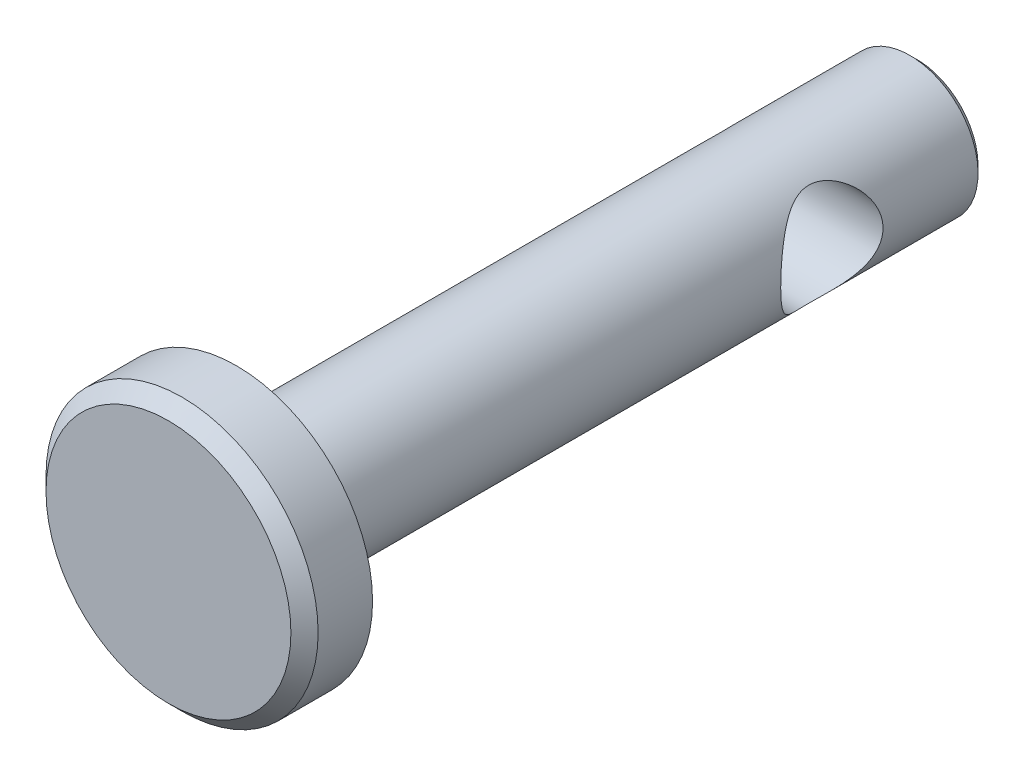
ISO-10303-21;
HEADER;
FILE_DESCRIPTION(('STEP AP214'),'2;1');
FILE_NAME('part.step','',(''),(''),'','','');
FILE_SCHEMA(('AUTOMOTIVE_DESIGN { 1 0 10303 214 1 1 1 1 }'));
ENDSEC;
DATA;
#1=APPLICATION_CONTEXT('core data for automotive mechanical design processes');
#2=APPLICATION_PROTOCOL_DEFINITION('international standard','automotive_design',2000,#1);
#3=PRODUCT_CONTEXT('',#1,'mechanical');
#4=PRODUCT('Part','Part','',(#3));
#5=PRODUCT_RELATED_PRODUCT_CATEGORY('part','',(#4));
#6=PRODUCT_DEFINITION_FORMATION('','',#4);
#7=PRODUCT_DEFINITION_CONTEXT('part definition',#1,'design');
#8=PRODUCT_DEFINITION('design','',#6,#7);
#9=PRODUCT_DEFINITION_SHAPE('','',#8);
#10=(LENGTH_UNIT() NAMED_UNIT(*) SI_UNIT(.MILLI.,.METRE.));
#11=(NAMED_UNIT(*) PLANE_ANGLE_UNIT() SI_UNIT($,.RADIAN.));
#12=(NAMED_UNIT(*) SI_UNIT($,.STERADIAN.) SOLID_ANGLE_UNIT());
#13=UNCERTAINTY_MEASURE_WITH_UNIT(LENGTH_MEASURE(1.E-05),#10,'distance_accuracy_value','');
#14=(GEOMETRIC_REPRESENTATION_CONTEXT(3) GLOBAL_UNCERTAINTY_ASSIGNED_CONTEXT((#13)) GLOBAL_UNIT_ASSIGNED_CONTEXT((#10,
#11,#12)) REPRESENTATION_CONTEXT('',''));
#15=CARTESIAN_POINT('',(0.,0.,0.));
#16=DIRECTION('',(0.,0.,1.));
#17=DIRECTION('',(1.,0.,0.));
#18=AXIS2_PLACEMENT_3D('',#15,#16,#17);
#19=CARTESIAN_POINT('',(0.,3.175,1.5875));
#20=DIRECTION('',(0.,0.,-1.));
#21=DIRECTION('',(0.,1.,0.));
#22=AXIS2_PLACEMENT_3D('',#19,#20,#21);
#23=PLANE('',#22);
#24=CARTESIAN_POINT('',(0.,0.,1.5875));
#25=DIRECTION('',(0.,0.,-1.));
#26=DIRECTION('',(0.,1.,0.));
#27=AXIS2_PLACEMENT_3D('',#24,#25,#26);
#28=CIRCLE('',#27,2.85749999999999);
#29=CARTESIAN_POINT('',(0.,2.85749999999999,1.5875));
#30=VERTEX_POINT('',#29);
#31=EDGE_CURVE('E59',#30,#30,#28,.F.);
#32=ORIENTED_EDGE('',*,*,#31,.T.);
#33=EDGE_LOOP('',(#32));
#34=FACE_BOUND('',#33,.T.);
#35=ADVANCED_FACE('F41',(#34),#23,.F.);
#36=CARTESIAN_POINT('',(0.,0.,-15.875));
#37=DIRECTION('',(0.,0.,1.));
#38=DIRECTION('',(0.,-1.,0.));
#39=AXIS2_PLACEMENT_3D('',#36,#37,#38);
#40=PLANE('',#39);
#41=CARTESIAN_POINT('',(0.,0.,-15.875));
#42=DIRECTION('',(0.,0.,1.));
#43=DIRECTION('',(0.,-1.,0.));
#44=AXIS2_PLACEMENT_3D('',#41,#42,#43);
#45=CIRCLE('',#44,1.42874999999996);
#46=CARTESIAN_POINT('',(0.,-1.42874999999996,-15.875));
#47=VERTEX_POINT('',#46);
#48=EDGE_CURVE('E10',#47,#47,#45,.F.);
#49=ORIENTED_EDGE('',*,*,#48,.T.);
#50=EDGE_LOOP('',(#49));
#51=FACE_BOUND('',#50,.T.);
#52=ADVANCED_FACE('F101',(#51),#40,.F.);
#53=CARTESIAN_POINT('',(0.,0.,1.5875));
#54=DIRECTION('',(0.,0.,1.));
#55=DIRECTION('',(0.,-1.,0.));
#56=AXIS2_PLACEMENT_3D('',#53,#54,#55);
#57=CYLINDRICAL_SURFACE('',#56,1.58749999999996);
#58=CARTESIAN_POINT('',(0.,0.,-15.71625));
#59=DIRECTION('',(0.,0.,1.));
#60=DIRECTION('',(0.,-1.,0.));
#61=AXIS2_PLACEMENT_3D('',#58,#59,#60);
#62=CIRCLE('',#61,1.58749999999996);
#63=CARTESIAN_POINT('',(0.,-1.58749999999996,-15.71625));
#64=VERTEX_POINT('',#63);
#65=EDGE_CURVE('E49',#64,#64,#62,.T.);
#66=ORIENTED_EDGE('',*,*,#65,.T.);
#67=EDGE_LOOP('',(#66));
#68=FACE_BOUND('',#67,.T.);
#69=CARTESIAN_POINT('',(1.58749999999996,0.,-11.1125));
#70=CARTESIAN_POINT('',(1.58749611202192,0.0582400089712494,-11.112504048731));
#71=CARTESIAN_POINT('',(1.58426132337945,0.116571092588428,-11.1167964551169));
#72=CARTESIAN_POINT('',(1.57161329724709,0.231395079350687,-11.1336957204802));
#73=CARTESIAN_POINT('',(1.56218511689408,0.28788318906127,-11.1463226887003));
#74=CARTESIAN_POINT('',(1.53805521874961,0.397051087064882,-11.1790302967116));
#75=CARTESIAN_POINT('',(1.52338545829249,0.449751678169732,-11.1990657928055));
#76=CARTESIAN_POINT('',(1.48987548341851,0.550689971898316,-11.2456434667305));
#77=CARTESIAN_POINT('',(1.47103637617336,0.598928854517479,-11.2721839173689));
#78=CARTESIAN_POINT('',(1.42848471386693,0.694680005115794,-11.3336187262041));
#79=CARTESIAN_POINT('',(1.40448224261945,0.74171012253274,-11.3690595150722));
#80=CARTESIAN_POINT('',(1.35445854154786,0.829553943149386,-11.4458299935339));
#81=CARTESIAN_POINT('',(1.32843424535865,0.870357914423504,-11.4871687107833));
#82=CARTESIAN_POINT('',(1.27068479737996,0.9531799323061,-11.584169997728));
#83=CARTESIAN_POINT('',(1.23888117921047,0.993742907098825,-11.6410335129717));
#84=CARTESIAN_POINT('',(1.178275635493,1.06489206788819,-11.762163401124));
#85=CARTESIAN_POINT('',(1.14946970080022,1.09549169878323,-11.8264196381265));
#86=CARTESIAN_POINT('',(1.10835974170717,1.13676501194142,-11.9386602569936));
#87=CARTESIAN_POINT('',(1.09379064722662,1.15067121407519,-11.9846148046341));
#88=CARTESIAN_POINT('',(1.06983233223599,1.17298121093542,-12.0791015965493));
#89=CARTESIAN_POINT('',(1.06043121477492,1.18139765178729,-12.1276276361145));
#90=CARTESIAN_POINT('',(1.0482907574516,1.19218967004258,-12.2266758845225));
#91=CARTESIAN_POINT('',(1.04561306901394,1.19450935132434,-12.2772122808398));
#92=CARTESIAN_POINT('',(1.04766413974648,1.19270985237305,-12.3780284771758));
#93=CARTESIAN_POINT('',(1.05239537560604,1.18858851900885,-12.4283081857502));
#94=CARTESIAN_POINT('',(1.06743533103026,1.17508360539052,-12.5215085968116));
#95=CARTESIAN_POINT('',(1.07708192277855,1.16632068351073,-12.564635159479));
#96=CARTESIAN_POINT('',(1.10026903393572,1.14447308122112,-12.648686024988));
#97=CARTESIAN_POINT('',(1.11381333728087,1.13138419928488,-12.6896081416781));
#98=CARTESIAN_POINT('',(1.15290197907022,1.09185551143224,-12.7939435116001));
#99=CARTESIAN_POINT('',(1.1806362202507,1.06219612507049,-12.8553164585136));
#100=CARTESIAN_POINT('',(1.23884845074033,0.993702457646841,-12.9713324826481));
#101=CARTESIAN_POINT('',(1.26933302873669,0.954845761924156,-13.0259586143659));
#102=CARTESIAN_POINT('',(1.3307177095422,0.867340615100063,-13.1294548253315));
#103=CARTESIAN_POINT('',(1.36160815500147,0.818464823163825,-13.1781393999279));
#104=CARTESIAN_POINT('',(1.42018729468893,0.711972733099075,-13.2670529443622));
#105=CARTESIAN_POINT('',(1.44788202748529,0.654373411630266,-13.3072979831154));
#106=CARTESIAN_POINT('',(1.49255937974563,0.543375678884274,-13.3707877427964));
#107=CARTESIAN_POINT('',(1.51057698528293,0.491421390850462,-13.3958217365705));
#108=CARTESIAN_POINT('',(1.54160267629896,0.383120959812429,-13.4384464306424));
#109=CARTESIAN_POINT('',(1.55461387180878,0.326777569607676,-13.4560417525893));
#110=CARTESIAN_POINT('',(1.57456526025459,0.210682235925732,-13.4828795513269));
#111=CARTESIAN_POINT('',(1.58146728549927,0.150911313378138,-13.4920695265348));
#112=CARTESIAN_POINT('',(1.58835864577543,0.0302752509871462,-13.5012457428002));
#113=CARTESIAN_POINT('',(1.5883510332554,-0.030589393802868,-13.5012360479663));
#114=CARTESIAN_POINT('',(1.5817945877245,-0.14501811852837,-13.4925049534587));
#115=CARTESIAN_POINT('',(1.57591384970654,-0.1986929850182,-13.484673329038));
#116=CARTESIAN_POINT('',(1.55908265824004,-0.303723073443494,-13.4620671690358));
#117=CARTESIAN_POINT('',(1.54813114648291,-0.355077808693203,-13.4472911841043));
#118=CARTESIAN_POINT('',(1.52151176197056,-0.456045209324149,-13.4109081835218));
#119=CARTESIAN_POINT('',(1.50569808574503,-0.505541757920168,-13.3890887703169));
#120=CARTESIAN_POINT('',(1.47055050484391,-0.600156812323727,-13.3396549943913));
#121=CARTESIAN_POINT('',(1.45121610643682,-0.645274702724286,-13.3120398188138));
#122=CARTESIAN_POINT('',(1.40668133727196,-0.737877110468318,-13.2467362523664));
#123=CARTESIAN_POINT('',(1.38104027666388,-0.784504868153483,-13.2081362236221));
#124=CARTESIAN_POINT('',(1.32814791913204,-0.871068853718371,-13.1248443846369));
#125=CARTESIAN_POINT('',(1.30089319575508,-0.910990097537625,-13.0801393275185));
#126=CARTESIAN_POINT('',(1.24150416985761,-0.990828264860102,-12.9760177439497));
#127=CARTESIAN_POINT('',(1.20943783950668,-1.02927233640268,-12.915424681195));
#128=CARTESIAN_POINT('',(1.14994929880441,-1.09532583053485,-12.7865405156686));
#129=CARTESIAN_POINT('',(1.12251399992908,-1.12296608908653,-12.7182720487179));
#130=CARTESIAN_POINT('',(1.0867545290757,-1.15736064850763,-12.602560847327));
#131=CARTESIAN_POINT('',(1.07514574754341,-1.16805755109581,-12.5573193816267));
#132=CARTESIAN_POINT('',(1.05740659988987,-1.18414258325223,-12.4649003511348));
#133=CARTESIAN_POINT('',(1.05126379878146,-1.18954276562458,-12.4177274376278));
#134=CARTESIAN_POINT('',(1.04546055627034,-1.19464934449511,-12.3223942180421));
#135=CARTESIAN_POINT('',(1.04583560652371,-1.19432456673063,-12.2742299332483));
#136=CARTESIAN_POINT('',(1.05308483711188,-1.18793443725808,-12.1787586214641));
#137=CARTESIAN_POINT('',(1.05996708886514,-1.18186195618976,-12.131452733496));
#138=CARTESIAN_POINT('',(1.08105685565797,-1.16263091032965,-12.0293913981011));
#139=CARTESIAN_POINT('',(1.09648769678375,-1.14826379093169,-11.9751260491005));
#140=CARTESIAN_POINT('',(1.13243372364878,-1.11282760223123,-11.8705974654786));
#141=CARTESIAN_POINT('',(1.15296179012178,-1.09174151519868,-11.8203448027819));
#142=CARTESIAN_POINT('',(1.20451193671727,-1.03501018570492,-11.7069300360419));
#143=CARTESIAN_POINT('',(1.23666801369913,-0.996854275300469,-11.6455422514579));
#144=CARTESIAN_POINT('',(1.3016358757298,-0.910405116618257,-11.5307446310665));
#145=CARTESIAN_POINT('',(1.3344482534269,-0.862102293521006,-11.4773424126508));
#146=CARTESIAN_POINT('',(1.39773998562547,-0.75523281332539,-11.3788802589423));
#147=CARTESIAN_POINT('',(1.42819461464783,-0.696574275019556,-11.3339031293991));
#148=CARTESIAN_POINT('',(1.48324162953056,-0.5699817399204,-11.2547231115381));
#149=CARTESIAN_POINT('',(1.50784795580829,-0.502070419774438,-11.220494538305));
#150=CARTESIAN_POINT('',(1.54233051377993,-0.379688308077811,-11.1731796706885));
#151=CARTESIAN_POINT('',(1.55440989792477,-0.32708317367634,-11.1568383003157));
#152=CARTESIAN_POINT('',(1.57322723786397,-0.219278478888914,-11.1315149829127));
#153=CARTESIAN_POINT('',(1.57997976971973,-0.164086439239145,-11.1225129507018));
#154=CARTESIAN_POINT('',(1.58502674119594,-0.0904161718022832,-11.1157906938166));
#155=CARTESIAN_POINT('',(1.5859525615958,-0.0723713822539422,-11.1145584010543));
#156=CARTESIAN_POINT('',(1.58718985023465,-0.0362206722883451,-11.1129123517672));
#157=CARTESIAN_POINT('',(1.58750120930124,-0.0181147415803635,-11.1124987406987));
#158=CARTESIAN_POINT('',(1.58749999999996,0.,-11.1125));
#159=B_SPLINE_CURVE_WITH_KNOTS('',3,(#69,#70,#71,#72,#73,#74,#75,#76,#77,#78,#79,#80,#81,#82,
#83,#84,#85,#86,#87,#88,#89,#90,#91,#92,#93,#94,#95,#96,#97,#98,#99,#100,#101,#102,#103,#104,
#105,#106,#107,#108,#109,#110,#111,#112,#113,#114,#115,#116,#117,#118,#119,#120,#121,#122,#123,
#124,#125,#126,#127,#128,#129,#130,#131,#132,#133,#134,#135,#136,#137,#138,#139,#140,#141,#142,
#143,#144,#145,#146,#147,#148,#149,#150,#151,#152,#153,#154,#155,#156,#157,#158),.UNSPECIFIED.,
.T.,.F.,(4,2,2,2,2,2,2,2,2,2,2,2,2,2,2,2,2,2,2,2,2,2,2,2,2,2,2,2,2,2,2,2,2,2,2,2,2,2,2,2,2,2,2,
2,4),(0.,0.174640947745298,0.34970480886234,0.52371904421097,0.697687125338497,
0.887786772593072,1.07818058109091,1.30747198334326,1.53645267659188,1.68647155013402,
1.83614361058131,1.98718317892455,2.13827324824997,2.27294091295009,2.40773975793308,
2.62731202673708,2.84742502470231,3.0732332860739,3.29860762349449,3.47914313832489,
3.65956632095643,3.84110891835785,4.02257131630783,4.18550204838061,4.34846680066054,
4.51689478880584,4.68534641481017,4.88184568379417,5.07877830580035,5.31352668791226,
5.54760007750776,5.69082209572992,5.8337174477156,5.97739115040059,6.12124329753638,
6.29493375520321,6.46906767851771,6.70520286421148,6.94156188058397,7.18013431619462,
7.41813223908071,7.58663566986335,7.75467640351584,7.80898638330881,7.86330601157875),.UNSPECIFIED.);
#160=CARTESIAN_POINT('',(1.58749999999996,0.,-11.1125));
#161=VERTEX_POINT('',#160);
#162=EDGE_CURVE('E66',#161,#161,#159,.T.);
#163=ORIENTED_EDGE('',*,*,#162,.T.);
#164=EDGE_LOOP('',(#163));
#165=FACE_BOUND('',#164,.T.);
#166=CARTESIAN_POINT('',(-1.58749999999996,0.,-11.1125));
#167=CARTESIAN_POINT('',(-1.58749611202192,-0.0582400089712493,-11.112504048731));
#168=CARTESIAN_POINT('',(-1.58426132337945,-0.116571092588428,-11.1167964551169));
#169=CARTESIAN_POINT('',(-1.57161329724709,-0.231395079350687,-11.1336957204802));
#170=CARTESIAN_POINT('',(-1.56218511689408,-0.287883189061271,-11.1463226887003));
#171=CARTESIAN_POINT('',(-1.53805521874961,-0.397051087064882,-11.1790302967116));
#172=CARTESIAN_POINT('',(-1.52338545829249,-0.449751678169732,-11.1990657928055));
#173=CARTESIAN_POINT('',(-1.48987548341851,-0.550689971898316,-11.2456434667305));
#174=CARTESIAN_POINT('',(-1.47103637617336,-0.598928854517479,-11.2721839173689));
#175=CARTESIAN_POINT('',(-1.42848471386693,-0.694680005115794,-11.3336187262041));
#176=CARTESIAN_POINT('',(-1.40448224261945,-0.74171012253274,-11.3690595150722));
#177=CARTESIAN_POINT('',(-1.35445854154786,-0.829553943149386,-11.4458299935339));
#178=CARTESIAN_POINT('',(-1.32843424535865,-0.870357914423504,-11.4871687107833));
#179=CARTESIAN_POINT('',(-1.27068479737996,-0.9531799323061,-11.584169997728));
#180=CARTESIAN_POINT('',(-1.23888117921047,-0.993742907098825,-11.6410335129717));
#181=CARTESIAN_POINT('',(-1.178275635493,-1.06489206788819,-11.762163401124));
#182=CARTESIAN_POINT('',(-1.14946970080022,-1.09549169878323,-11.8264196381265));
#183=CARTESIAN_POINT('',(-1.10835974170717,-1.13676501194142,-11.9386602569936));
#184=CARTESIAN_POINT('',(-1.09379064722662,-1.15067121407519,-11.9846148046341));
#185=CARTESIAN_POINT('',(-1.06983233223599,-1.17298121093542,-12.0791015965493));
#186=CARTESIAN_POINT('',(-1.06043121477492,-1.18139765178729,-12.1276276361145));
#187=CARTESIAN_POINT('',(-1.0482907574516,-1.19218967004258,-12.2266758845225));
#188=CARTESIAN_POINT('',(-1.04561306901394,-1.19450935132434,-12.2772122808398));
#189=CARTESIAN_POINT('',(-1.04766413974648,-1.19270985237305,-12.3780284771758));
#190=CARTESIAN_POINT('',(-1.05239537560604,-1.18858851900885,-12.4283081857502));
#191=CARTESIAN_POINT('',(-1.06743533103026,-1.17508360539052,-12.5215085968116));
#192=CARTESIAN_POINT('',(-1.07708192277855,-1.16632068351073,-12.564635159479));
#193=CARTESIAN_POINT('',(-1.10026903393572,-1.14447308122112,-12.648686024988));
#194=CARTESIAN_POINT('',(-1.11381333728087,-1.13138419928488,-12.6896081416781));
#195=CARTESIAN_POINT('',(-1.15290197907022,-1.09185551143224,-12.7939435116001));
#196=CARTESIAN_POINT('',(-1.1806362202507,-1.06219612507049,-12.8553164585136));
#197=CARTESIAN_POINT('',(-1.23884845074033,-0.993702457646841,-12.9713324826481));
#198=CARTESIAN_POINT('',(-1.26933302873669,-0.954845761924156,-13.0259586143659));
#199=CARTESIAN_POINT('',(-1.3307177095422,-0.867340615100063,-13.1294548253315));
#200=CARTESIAN_POINT('',(-1.36160815500147,-0.818464823163825,-13.1781393999279));
#201=CARTESIAN_POINT('',(-1.42018729468893,-0.711972733099075,-13.2670529443622));
#202=CARTESIAN_POINT('',(-1.44788202748529,-0.654373411630267,-13.3072979831154));
#203=CARTESIAN_POINT('',(-1.49255937974563,-0.543375678884276,-13.3707877427964));
#204=CARTESIAN_POINT('',(-1.51057698528293,-0.491421390850463,-13.3958217365705));
#205=CARTESIAN_POINT('',(-1.54160267629896,-0.38312095981243,-13.4384464306424));
#206=CARTESIAN_POINT('',(-1.55461387180878,-0.326777569607676,-13.4560417525893));
#207=CARTESIAN_POINT('',(-1.57456526025459,-0.210682235925732,-13.4828795513269));
#208=CARTESIAN_POINT('',(-1.58146728549927,-0.150911313378138,-13.4920695265348));
#209=CARTESIAN_POINT('',(-1.58835864577543,-0.0302752509871465,-13.5012457428002));
#210=CARTESIAN_POINT('',(-1.5883510332554,0.0305893938028677,-13.5012360479663));
#211=CARTESIAN_POINT('',(-1.5817945877245,0.14501811852837,-13.4925049534587));
#212=CARTESIAN_POINT('',(-1.57591384970654,0.1986929850182,-13.484673329038));
#213=CARTESIAN_POINT('',(-1.55908265824004,0.303723073443494,-13.4620671690358));
#214=CARTESIAN_POINT('',(-1.54813114648291,0.355077808693203,-13.4472911841043));
#215=CARTESIAN_POINT('',(-1.52151176197056,0.456045209324149,-13.4109081835218));
#216=CARTESIAN_POINT('',(-1.50569808574503,0.505541757920168,-13.3890887703169));
#217=CARTESIAN_POINT('',(-1.47055050484391,0.600156812323726,-13.3396549943913));
#218=CARTESIAN_POINT('',(-1.45121610643682,0.645274702724286,-13.3120398188138));
#219=CARTESIAN_POINT('',(-1.40668133727196,0.737877110468318,-13.2467362523664));
#220=CARTESIAN_POINT('',(-1.38104027666388,0.784504868153483,-13.2081362236221));
#221=CARTESIAN_POINT('',(-1.32814791913204,0.871068853718371,-13.1248443846369));
#222=CARTESIAN_POINT('',(-1.30089319575508,0.910990097537624,-13.0801393275185));
#223=CARTESIAN_POINT('',(-1.24150416985761,0.990828264860101,-12.9760177439497));
#224=CARTESIAN_POINT('',(-1.20943783950668,1.02927233640268,-12.915424681195));
#225=CARTESIAN_POINT('',(-1.14994929880441,1.09532583053485,-12.7865405156686));
#226=CARTESIAN_POINT('',(-1.12251399992908,1.12296608908653,-12.7182720487179));
#227=CARTESIAN_POINT('',(-1.0867545290757,1.15736064850763,-12.602560847327));
#228=CARTESIAN_POINT('',(-1.07514574754341,1.16805755109581,-12.5573193816267));
#229=CARTESIAN_POINT('',(-1.05740659988987,1.18414258325223,-12.4649003511348));
#230=CARTESIAN_POINT('',(-1.05126379878146,1.18954276562458,-12.4177274376278));
#231=CARTESIAN_POINT('',(-1.04546055627034,1.19464934449511,-12.3223942180421));
#232=CARTESIAN_POINT('',(-1.04583560652371,1.19432456673063,-12.2742299332483));
#233=CARTESIAN_POINT('',(-1.05308483711188,1.18793443725808,-12.1787586214641));
#234=CARTESIAN_POINT('',(-1.05996708886514,1.18186195618976,-12.131452733496));
#235=CARTESIAN_POINT('',(-1.08105685565797,1.16263091032965,-12.0293913981011));
#236=CARTESIAN_POINT('',(-1.09648769678375,1.14826379093169,-11.9751260491005));
#237=CARTESIAN_POINT('',(-1.13243372364878,1.11282760223123,-11.8705974654786));
#238=CARTESIAN_POINT('',(-1.15296179012178,1.09174151519868,-11.8203448027819));
#239=CARTESIAN_POINT('',(-1.20451193671727,1.03501018570492,-11.7069300360419));
#240=CARTESIAN_POINT('',(-1.23666801369914,0.996854275300467,-11.6455422514579));
#241=CARTESIAN_POINT('',(-1.30163587572981,0.910405116618255,-11.5307446310665));
#242=CARTESIAN_POINT('',(-1.3344482534269,0.862102293521003,-11.4773424126508));
#243=CARTESIAN_POINT('',(-1.39773998562547,0.755232813325386,-11.3788802589423));
#244=CARTESIAN_POINT('',(-1.42819461464783,0.696574275019551,-11.3339031293991));
#245=CARTESIAN_POINT('',(-1.48324162953056,0.569981739920395,-11.2547231115381));
#246=CARTESIAN_POINT('',(-1.5078479558083,0.502070419774433,-11.220494538305));
#247=CARTESIAN_POINT('',(-1.54233051377993,0.379688308077806,-11.1731796706885));
#248=CARTESIAN_POINT('',(-1.55440989792477,0.327083173676335,-11.1568383003157));
#249=CARTESIAN_POINT('',(-1.57322723786397,0.219278478888909,-11.1315149829127));
#250=CARTESIAN_POINT('',(-1.57997976971973,0.16408643923914,-11.1225129507018));
#251=CARTESIAN_POINT('',(-1.58502674119594,0.0904161718022791,-11.1157906938166));
#252=CARTESIAN_POINT('',(-1.58595256159581,0.072371382253939,-11.1145584010543));
#253=CARTESIAN_POINT('',(-1.58718985023465,0.0362206722883434,-11.1129123517672));
#254=CARTESIAN_POINT('',(-1.58750120930124,0.0181147415803627,-11.1124987406987));
#255=CARTESIAN_POINT('',(-1.58749999999996,0.,-11.1125));
#256=B_SPLINE_CURVE_WITH_KNOTS('',3,(#166,#167,#168,#169,#170,#171,#172,#173,#174,#175,#176,
#177,#178,#179,#180,#181,#182,#183,#184,#185,#186,#187,#188,#189,#190,#191,#192,#193,#194,#195,
#196,#197,#198,#199,#200,#201,#202,#203,#204,#205,#206,#207,#208,#209,#210,#211,#212,#213,#214,
#215,#216,#217,#218,#219,#220,#221,#222,#223,#224,#225,#226,#227,#228,#229,#230,#231,#232,#233,
#234,#235,#236,#237,#238,#239,#240,#241,#242,#243,#244,#245,#246,#247,#248,#249,#250,#251,#252,
#253,#254,#255),.UNSPECIFIED.,.T.,.F.,(4,2,2,2,2,2,2,2,2,2,2,2,2,2,2,2,2,2,2,2,2,2,2,2,2,2,2,2,
2,2,2,2,2,2,2,2,2,2,2,2,2,2,2,2,4),(0.,0.174640947745298,0.34970480886234,0.52371904421097,
0.697687125338497,0.887786772593072,1.07818058109091,1.30747198334326,1.53645267659188,
1.68647155013402,1.83614361058131,1.98718317892455,2.13827324824997,2.27294091295009,
2.40773975793308,2.62731202673708,2.84742502470231,3.0732332860739,3.29860762349449,
3.47914313832489,3.65956632095643,3.84110891835785,4.02257131630783,4.18550204838061,
4.34846680066054,4.51689478880585,4.68534641481017,4.88184568379418,5.07877830580035,
5.31352668791226,5.54760007750776,5.69082209572992,5.8337174477156,5.97739115040059,
6.12124329753638,6.29493375520322,6.46906767851772,6.70520286421148,6.94156188058397,
7.18013431619463,7.41813223908071,7.58663566986336,7.75467640351585,7.80898638330882,
7.86330601157875),.UNSPECIFIED.);
#257=CARTESIAN_POINT('',(-1.58749999999996,0.,-11.1125));
#258=VERTEX_POINT('',#257);
#259=EDGE_CURVE('E76',#258,#258,#256,.T.);
#260=ORIENTED_EDGE('',*,*,#259,.T.);
#261=EDGE_LOOP('',(#260));
#262=FACE_BOUND('',#261,.T.);
#263=CARTESIAN_POINT('',(0.,0.,0.));
#264=DIRECTION('',(0.,0.,1.));
#265=DIRECTION('',(0.,-1.,0.));
#266=AXIS2_PLACEMENT_3D('',#263,#264,#265);
#267=CIRCLE('',#266,1.58749999999996);
#268=CARTESIAN_POINT('',(0.,-1.58749999999996,0.));
#269=VERTEX_POINT('',#268);
#270=EDGE_CURVE('E65',#269,#269,#267,.T.);
#271=ORIENTED_EDGE('',*,*,#270,.F.);
#272=EDGE_LOOP('',(#271));
#273=FACE_BOUND('',#272,.T.);
#274=ADVANCED_FACE('F81',(#68,#165,#262,#273),#57,.T.);
#275=CARTESIAN_POINT('',(0.,1.58749999999996,0.));
#276=DIRECTION('',(0.,0.,1.));
#277=DIRECTION('',(0.,-1.,0.));
#278=AXIS2_PLACEMENT_3D('',#275,#276,#277);
#279=PLANE('',#278);
#280=CARTESIAN_POINT('',(0.,0.,0.));
#281=DIRECTION('',(0.,0.,1.));
#282=DIRECTION('',(0.,-1.,0.));
#283=AXIS2_PLACEMENT_3D('',#280,#281,#282);
#284=CIRCLE('',#283,3.175);
#285=CARTESIAN_POINT('',(0.,-3.175,0.));
#286=VERTEX_POINT('',#285);
#287=EDGE_CURVE('E75',#286,#286,#284,.T.);
#288=ORIENTED_EDGE('',*,*,#287,.F.);
#289=EDGE_LOOP('',(#288));
#290=FACE_BOUND('',#289,.T.);
#291=ORIENTED_EDGE('',*,*,#270,.T.);
#292=EDGE_LOOP('',(#291));
#293=FACE_BOUND('',#292,.T.);
#294=ADVANCED_FACE('F94',(#290,#293),#279,.F.);
#295=CARTESIAN_POINT('',(0.,0.,1.5875));
#296=DIRECTION('',(0.,0.,1.));
#297=DIRECTION('',(0.,-1.,0.));
#298=AXIS2_PLACEMENT_3D('',#295,#296,#297);
#299=CYLINDRICAL_SURFACE('',#298,3.175);
#300=CARTESIAN_POINT('',(0.,0.,1.26999999999999));
#301=DIRECTION('',(0.,0.,-1.));
#302=DIRECTION('',(0.,1.,0.));
#303=AXIS2_PLACEMENT_3D('',#300,#301,#302);
#304=CIRCLE('',#303,3.175);
#305=CARTESIAN_POINT('',(0.,3.175,1.26999999999999));
#306=VERTEX_POINT('',#305);
#307=EDGE_CURVE('E54',#306,#306,#304,.T.);
#308=ORIENTED_EDGE('',*,*,#307,.T.);
#309=EDGE_LOOP('',(#308));
#310=FACE_BOUND('',#309,.T.);
#311=ORIENTED_EDGE('',*,*,#287,.T.);
#312=EDGE_LOOP('',(#311));
#313=FACE_BOUND('',#312,.T.);
#314=ADVANCED_FACE('F90',(#310,#313),#299,.T.);
#315=CARTESIAN_POINT('',(3.175,0.,-12.3063));
#316=DIRECTION('',(-1.,0.,0.));
#317=DIRECTION('',(0.,0.,1.));
#318=AXIS2_PLACEMENT_3D('',#315,#316,#317);
#319=CYLINDRICAL_SURFACE('',#318,1.1938);
#320=ORIENTED_EDGE('',*,*,#259,.F.);
#321=EDGE_LOOP('',(#320));
#322=FACE_BOUND('',#321,.T.);
#323=ORIENTED_EDGE('',*,*,#162,.F.);
#324=EDGE_LOOP('',(#323));
#325=FACE_BOUND('',#324,.T.);
#326=ADVANCED_FACE('F85',(#322,#325),#319,.F.);
#327=CARTESIAN_POINT('',(0.,0.,1.5875));
#328=DIRECTION('',(0.,0.,-1.));
#329=DIRECTION('',(0.,1.,0.));
#330=AXIS2_PLACEMENT_3D('',#327,#328,#329);
#331=CONICAL_SURFACE('',#330,2.85749999999999,0.78539816339745);
#332=ORIENTED_EDGE('',*,*,#307,.F.);
#333=EDGE_LOOP('',(#332));
#334=FACE_BOUND('',#333,.T.);
#335=ORIENTED_EDGE('',*,*,#31,.F.);
#336=EDGE_LOOP('',(#335));
#337=FACE_BOUND('',#336,.T.);
#338=ADVANCED_FACE('F89',(#334,#337),#331,.T.);
#339=CARTESIAN_POINT('',(0.,0.,-15.71625));
#340=DIRECTION('',(0.,0.,1.));
#341=DIRECTION('',(0.,-1.,0.));
#342=AXIS2_PLACEMENT_3D('',#339,#340,#341);
#343=CONICAL_SURFACE('',#342,1.58749999999996,0.78539816339744);
#344=CARTESIAN_POINT('',(0.,-1.42874999999996,-15.875));
#345=CARTESIAN_POINT('',(0.,-1.4304036458333,-15.8733463541667));
#346=CARTESIAN_POINT('',(0.,-1.43205729166663,-15.8716927083333));
#347=CARTESIAN_POINT('',(0.,-1.4353645833333,-15.8683854166667));
#348=CARTESIAN_POINT('',(0.,-1.43701822916663,-15.8667317708333));
#349=CARTESIAN_POINT('',(0.,-1.4403255208333,-15.8634244791667));
#350=CARTESIAN_POINT('',(0.,-1.44197916666663,-15.8617708333333));
#351=CARTESIAN_POINT('',(0.,-1.4452864583333,-15.8584635416667));
#352=CARTESIAN_POINT('',(0.,-1.44694010416663,-15.8568098958333));
#353=CARTESIAN_POINT('',(0.,-1.4502473958333,-15.8535026041667));
#354=CARTESIAN_POINT('',(0.,-1.45190104166663,-15.8518489583333));
#355=CARTESIAN_POINT('',(0.,-1.4552083333333,-15.8485416666667));
#356=CARTESIAN_POINT('',(0.,-1.45686197916663,-15.8468880208333));
#357=CARTESIAN_POINT('',(0.,-1.46016927083329,-15.8435807291667));
#358=CARTESIAN_POINT('',(0.,-1.46182291666663,-15.8419270833333));
#359=CARTESIAN_POINT('',(0.,-1.46513020833329,-15.8386197916667));
#360=CARTESIAN_POINT('',(0.,-1.46678385416663,-15.8369661458333));
#361=CARTESIAN_POINT('',(0.,-1.47009114583329,-15.8336588541667));
#362=CARTESIAN_POINT('',(0.,-1.47174479166663,-15.8320052083333));
#363=CARTESIAN_POINT('',(0.,-1.47505208333329,-15.8286979166667));
#364=CARTESIAN_POINT('',(0.,-1.47670572916663,-15.8270442708333));
#365=CARTESIAN_POINT('',(0.,-1.48001302083329,-15.8237369791667));
#366=CARTESIAN_POINT('',(0.,-1.48166666666663,-15.8220833333333));
#367=CARTESIAN_POINT('',(0.,-1.48497395833329,-15.8187760416667));
#368=CARTESIAN_POINT('',(0.,-1.48662760416663,-15.8171223958333));
#369=CARTESIAN_POINT('',(0.,-1.48993489583329,-15.8138151041667));
#370=CARTESIAN_POINT('',(0.,-1.49158854166663,-15.8121614583333));
#371=CARTESIAN_POINT('',(0.,-1.49489583333329,-15.8088541666667));
#372=CARTESIAN_POINT('',(0.,-1.49654947916663,-15.8072005208333));
#373=CARTESIAN_POINT('',(0.,-1.49985677083329,-15.8038932291667));
#374=CARTESIAN_POINT('',(0.,-1.50151041666663,-15.8022395833333));
#375=CARTESIAN_POINT('',(0.,-1.50481770833329,-15.7989322916667));
#376=CARTESIAN_POINT('',(0.,-1.50647135416663,-15.7972786458333));
#377=CARTESIAN_POINT('',(0.,-1.50977864583329,-15.7939713541667));
#378=CARTESIAN_POINT('',(0.,-1.51143229166663,-15.7923177083333));
#379=CARTESIAN_POINT('',(0.,-1.51473958333329,-15.7890104166667));
#380=CARTESIAN_POINT('',(0.,-1.51639322916663,-15.7873567708333));
#381=CARTESIAN_POINT('',(0.,-1.51970052083329,-15.7840494791667));
#382=CARTESIAN_POINT('',(0.,-1.52135416666663,-15.7823958333333));
#383=CARTESIAN_POINT('',(0.,-1.52466145833329,-15.7790885416667));
#384=CARTESIAN_POINT('',(0.,-1.52631510416663,-15.7774348958333));
#385=CARTESIAN_POINT('',(0.,-1.52962239583329,-15.7741276041667));
#386=CARTESIAN_POINT('',(0.,-1.53127604166663,-15.7724739583333));
#387=CARTESIAN_POINT('',(0.,-1.53458333333329,-15.7691666666667));
#388=CARTESIAN_POINT('',(0.,-1.53623697916662,-15.7675130208333));
#389=CARTESIAN_POINT('',(0.,-1.53954427083329,-15.7642057291667));
#390=CARTESIAN_POINT('',(0.,-1.54119791666662,-15.7625520833333));
#391=CARTESIAN_POINT('',(0.,-1.54450520833329,-15.7592447916667));
#392=CARTESIAN_POINT('',(0.,-1.54615885416662,-15.7575911458333));
#393=CARTESIAN_POINT('',(0.,-1.54946614583329,-15.7542838541667));
#394=CARTESIAN_POINT('',(0.,-1.55111979166662,-15.7526302083333));
#395=CARTESIAN_POINT('',(0.,-1.55442708333329,-15.7493229166667));
#396=CARTESIAN_POINT('',(0.,-1.55608072916662,-15.7476692708333));
#397=CARTESIAN_POINT('',(0.,-1.55938802083329,-15.7443619791667));
#398=CARTESIAN_POINT('',(0.,-1.56104166666662,-15.7427083333333));
#399=CARTESIAN_POINT('',(0.,-1.56434895833329,-15.7394010416667));
#400=CARTESIAN_POINT('',(0.,-1.56600260416662,-15.7377473958333));
#401=CARTESIAN_POINT('',(0.,-1.56930989583329,-15.7344401041667));
#402=CARTESIAN_POINT('',(0.,-1.57096354166662,-15.7327864583333));
#403=CARTESIAN_POINT('',(0.,-1.57427083333329,-15.7294791666667));
#404=CARTESIAN_POINT('',(0.,-1.57592447916662,-15.7278255208333));
#405=CARTESIAN_POINT('',(0.,-1.57923177083329,-15.7245182291667));
#406=CARTESIAN_POINT('',(0.,-1.58088541666662,-15.7228645833333));
#407=CARTESIAN_POINT('',(0.,-1.58419270833329,-15.7195572916667));
#408=CARTESIAN_POINT('',(0.,-1.58584635416662,-15.7179036458333));
#409=CARTESIAN_POINT('',(0.,-1.58749999999996,-15.71625));
#410=B_SPLINE_CURVE_WITH_KNOTS('',3,(#344,#345,#346,#347,#348,#349,#350,#351,#352,#353,#354,
#355,#356,#357,#358,#359,#360,#361,#362,#363,#364,#365,#366,#367,#368,#369,#370,#371,#372,#373,
#374,#375,#376,#377,#378,#379,#380,#381,#382,#383,#384,#385,#386,#387,#388,#389,#390,#391,#392,
#393,#394,#395,#396,#397,#398,#399,#400,#401,#402,#403,#404,#405,#406,#407,#408,#409),
.UNSPECIFIED.,.F.,.F.,(4,2,2,2,2,2,2,2,2,2,2,2,2,2,2,2,2,2,2,2,2,2,2,2,2,2,2,2,2,2,2,2,4),(0.,
0.00701582509458723,0.014031650189172,0.0210474752837568,0.0280633003783416,0.0350791254729263,
0.0420949505675111,0.0491107756620961,0.0561266007566808,0.0631424258512656,0.0701582509458504,
0.0771740760404376,0.0841899011350224,0.0912057262296072,0.0982215513241921,0.105237376418777,
0.112253201513362,0.119269026607946,0.126284851702531,0.133300676797116,0.140316501891701,
0.147332326986286,0.154348152080873,0.161363977175458,0.168379802270043,0.175395627364627,
0.182411452459212,0.189427277553797,0.196443102648382,0.203458927742967,0.210474752837551,
0.217490577932136,0.224506403026723),.UNSPECIFIED.);
#411=EDGE_CURVE('BSEAM43',#47,#64,#410,.T.);
#412=ORIENTED_EDGE('',*,*,#48,.F.);
#413=ORIENTED_EDGE('',*,*,#65,.F.);
#414=ORIENTED_EDGE('',*,*,#411,.T.);
#415=ORIENTED_EDGE('',*,*,#411,.F.);
#416=EDGE_LOOP('',(#412,#414,#413,#415));
#417=FACE_BOUND('',#416,.T.);
#418=ADVANCED_FACE('F43',(#417),#343,.T.);
#419=CLOSED_SHELL('',(#35,#52,#274,#294,#314,#326,#338,#418));
#420=MANIFOLD_SOLID_BREP('B2',#419);
#421=ADVANCED_BREP_SHAPE_REPRESENTATION('',(#18,#420),#14);
#422=SHAPE_DEFINITION_REPRESENTATION(#9,#421);
ENDSEC;
END-ISO-10303-21;
